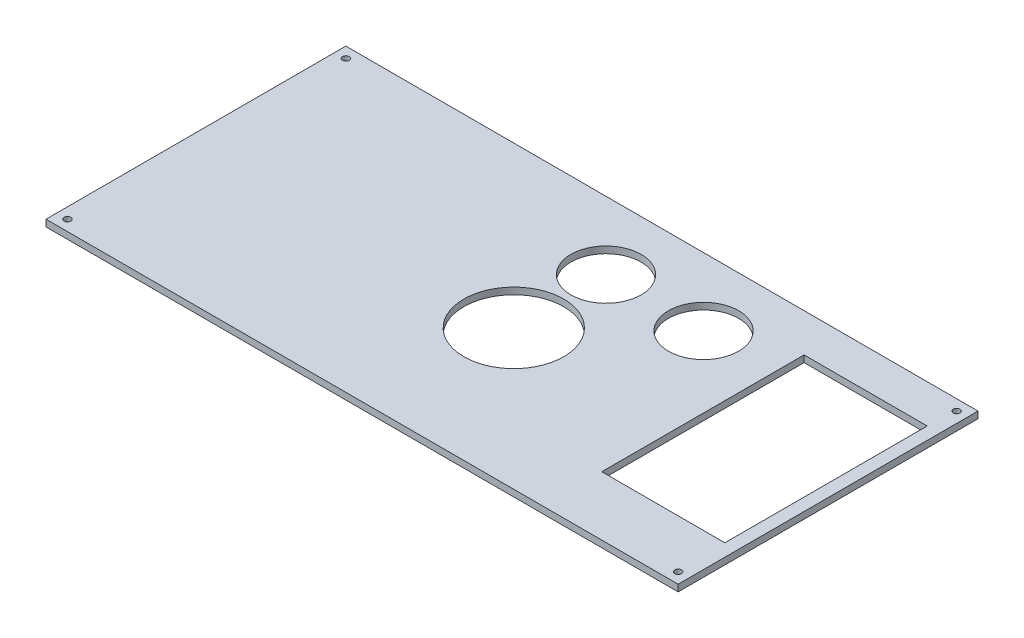
ISO-10303-21;
HEADER;
FILE_DESCRIPTION(('STEP AP214'),'2;1');
FILE_NAME('part.step','',(''),(''),'','','');
FILE_SCHEMA(('AUTOMOTIVE_DESIGN { 1 0 10303 214 1 1 1 1 }'));
ENDSEC;
DATA;
#1=APPLICATION_CONTEXT('core data for automotive mechanical design processes');
#2=APPLICATION_PROTOCOL_DEFINITION('international standard','automotive_design',2000,#1);
#3=PRODUCT_CONTEXT('',#1,'mechanical');
#4=PRODUCT('Part','Part','',(#3));
#5=PRODUCT_RELATED_PRODUCT_CATEGORY('part','',(#4));
#6=PRODUCT_DEFINITION_FORMATION('','',#4);
#7=PRODUCT_DEFINITION_CONTEXT('part definition',#1,'design');
#8=PRODUCT_DEFINITION('design','',#6,#7);
#9=PRODUCT_DEFINITION_SHAPE('','',#8);
#10=(LENGTH_UNIT() NAMED_UNIT(*) SI_UNIT(.MILLI.,.METRE.));
#11=(NAMED_UNIT(*) PLANE_ANGLE_UNIT() SI_UNIT($,.RADIAN.));
#12=(NAMED_UNIT(*) SI_UNIT($,.STERADIAN.) SOLID_ANGLE_UNIT());
#13=UNCERTAINTY_MEASURE_WITH_UNIT(LENGTH_MEASURE(1.E-05),#10,'distance_accuracy_value','');
#14=(GEOMETRIC_REPRESENTATION_CONTEXT(3) GLOBAL_UNCERTAINTY_ASSIGNED_CONTEXT((#13)) GLOBAL_UNIT_ASSIGNED_CONTEXT((#10,
#11,#12)) REPRESENTATION_CONTEXT('',''));
#15=CARTESIAN_POINT('',(0.,0.,0.));
#16=DIRECTION('',(0.,0.,1.));
#17=DIRECTION('',(1.,0.,0.));
#18=AXIS2_PLACEMENT_3D('',#15,#16,#17);
#19=CARTESIAN_POINT('',(-117.945,2.5,55.945));
#20=DIRECTION('',(1.,0.,0.));
#21=DIRECTION('',(0.,0.,-1.));
#22=AXIS2_PLACEMENT_3D('',#19,#20,#21);
#23=PLANE('',#22);
#24=DIRECTION('',(0.,0.,1.));
#25=VECTOR('',#24,1.);
#26=CARTESIAN_POINT('',(-117.945,0.,55.945));
#27=LINE('',#26,#25);
#28=CARTESIAN_POINT('',(-117.945,0.,-55.945));
#29=VERTEX_POINT('',#28);
#30=CARTESIAN_POINT('',(-117.945,0.,55.945));
#31=VERTEX_POINT('',#30);
#32=EDGE_CURVE('E210',#29,#31,#27,.T.);
#33=ORIENTED_EDGE('',*,*,#32,.T.);
#34=DIRECTION('',(0.,-1.,0.));
#35=VECTOR('',#34,1.);
#36=CARTESIAN_POINT('',(-117.945,2.5,55.945));
#37=LINE('',#36,#35);
#38=CARTESIAN_POINT('',(-117.945,2.5,55.945));
#39=VERTEX_POINT('',#38);
#40=EDGE_CURVE('E11',#39,#31,#37,.T.);
#41=ORIENTED_EDGE('',*,*,#40,.F.);
#42=DIRECTION('',(0.,0.,1.));
#43=VECTOR('',#42,1.);
#44=CARTESIAN_POINT('',(-117.945,2.5,55.945));
#45=LINE('',#44,#43);
#46=CARTESIAN_POINT('',(-117.945,2.5,-55.945));
#47=VERTEX_POINT('',#46);
#48=EDGE_CURVE('E214',#47,#39,#45,.T.);
#49=ORIENTED_EDGE('',*,*,#48,.F.);
#50=DIRECTION('',(0.,-1.,0.));
#51=VECTOR('',#50,1.);
#52=CARTESIAN_POINT('',(-117.945,2.5,-55.945));
#53=LINE('',#52,#51);
#54=EDGE_CURVE('E228',#47,#29,#53,.T.);
#55=ORIENTED_EDGE('',*,*,#54,.T.);
#56=EDGE_LOOP('',(#33,#41,#49,#55));
#57=FACE_BOUND('',#56,.T.);
#58=ADVANCED_FACE('F44',(#57),#23,.F.);
#59=CARTESIAN_POINT('',(117.945,2.5,55.945));
#60=DIRECTION('',(0.,0.,-1.));
#61=DIRECTION('',(-1.,0.,0.));
#62=AXIS2_PLACEMENT_3D('',#59,#60,#61);
#63=PLANE('',#62);
#64=DIRECTION('',(1.,0.,0.));
#65=VECTOR('',#64,1.);
#66=CARTESIAN_POINT('',(117.945,0.,55.945));
#67=LINE('',#66,#65);
#68=CARTESIAN_POINT('',(117.945,0.,55.945));
#69=VERTEX_POINT('',#68);
#70=EDGE_CURVE('E232',#31,#69,#67,.T.);
#71=ORIENTED_EDGE('',*,*,#70,.T.);
#72=DIRECTION('',(0.,-1.,0.));
#73=VECTOR('',#72,1.);
#74=CARTESIAN_POINT('',(117.945,2.5,55.945));
#75=LINE('',#74,#73);
#76=CARTESIAN_POINT('',(117.945,2.5,55.945));
#77=VERTEX_POINT('',#76);
#78=EDGE_CURVE('E52',#77,#69,#75,.T.);
#79=ORIENTED_EDGE('',*,*,#78,.F.);
#80=DIRECTION('',(1.,0.,0.));
#81=VECTOR('',#80,1.);
#82=CARTESIAN_POINT('',(117.945,2.5,55.945));
#83=LINE('',#82,#81);
#84=EDGE_CURVE('E218',#39,#77,#83,.T.);
#85=ORIENTED_EDGE('',*,*,#84,.F.);
#86=ORIENTED_EDGE('',*,*,#40,.T.);
#87=EDGE_LOOP('',(#71,#79,#85,#86));
#88=FACE_BOUND('',#87,.T.);
#89=ADVANCED_FACE('F267',(#88),#63,.F.);
#90=CARTESIAN_POINT('',(117.945,2.5,55.945));
#91=DIRECTION('',(-1.,0.,0.));
#92=DIRECTION('',(0.,0.,1.));
#93=AXIS2_PLACEMENT_3D('',#90,#91,#92);
#94=PLANE('',#93);
#95=DIRECTION('',(0.,0.,-1.));
#96=VECTOR('',#95,1.);
#97=CARTESIAN_POINT('',(117.945,0.,55.945));
#98=LINE('',#97,#96);
#99=CARTESIAN_POINT('',(117.945,0.,-55.945));
#100=VERTEX_POINT('',#99);
#101=EDGE_CURVE('E235',#69,#100,#98,.T.);
#102=ORIENTED_EDGE('',*,*,#101,.T.);
#103=DIRECTION('',(0.,-1.,0.));
#104=VECTOR('',#103,1.);
#105=CARTESIAN_POINT('',(117.945,2.5,-55.945));
#106=LINE('',#105,#104);
#107=CARTESIAN_POINT('',(117.945,2.5,-55.945));
#108=VERTEX_POINT('',#107);
#109=EDGE_CURVE('E243',#108,#100,#106,.T.);
#110=ORIENTED_EDGE('',*,*,#109,.F.);
#111=DIRECTION('',(0.,0.,-1.));
#112=VECTOR('',#111,1.);
#113=CARTESIAN_POINT('',(117.945,2.5,55.945));
#114=LINE('',#113,#112);
#115=EDGE_CURVE('E222',#77,#108,#114,.T.);
#116=ORIENTED_EDGE('',*,*,#115,.F.);
#117=ORIENTED_EDGE('',*,*,#78,.T.);
#118=EDGE_LOOP('',(#102,#110,#116,#117));
#119=FACE_BOUND('',#118,.T.);
#120=ADVANCED_FACE('F252',(#119),#94,.F.);
#121=CARTESIAN_POINT('',(117.945,2.5,-55.945));
#122=DIRECTION('',(0.,0.,1.));
#123=DIRECTION('',(1.,0.,0.));
#124=AXIS2_PLACEMENT_3D('',#121,#122,#123);
#125=PLANE('',#124);
#126=DIRECTION('',(-1.,0.,0.));
#127=VECTOR('',#126,1.);
#128=CARTESIAN_POINT('',(117.945,0.,-55.945));
#129=LINE('',#128,#127);
#130=EDGE_CURVE('E219',#100,#29,#129,.T.);
#131=ORIENTED_EDGE('',*,*,#130,.T.);
#132=ORIENTED_EDGE('',*,*,#54,.F.);
#133=DIRECTION('',(-1.,0.,0.));
#134=VECTOR('',#133,1.);
#135=CARTESIAN_POINT('',(117.945,2.5,-55.945));
#136=LINE('',#135,#134);
#137=EDGE_CURVE('E225',#108,#47,#136,.T.);
#138=ORIENTED_EDGE('',*,*,#137,.F.);
#139=ORIENTED_EDGE('',*,*,#109,.T.);
#140=EDGE_LOOP('',(#131,#132,#138,#139));
#141=FACE_BOUND('',#140,.T.);
#142=ADVANCED_FACE('F260',(#141),#125,.F.);
#143=CARTESIAN_POINT('',(0.,2.5,0.));
#144=DIRECTION('',(0.,1.,0.));
#145=DIRECTION('',(0.,0.,1.));
#146=AXIS2_PLACEMENT_3D('',#143,#144,#145);
#147=PLANE('',#146);
#148=DIRECTION('',(0.,0.,-1.));
#149=VECTOR('',#148,1.);
#150=CARTESIAN_POINT('',(113.2871,2.5,0.));
#151=LINE('',#150,#149);
#152=CARTESIAN_POINT('',(113.2871,2.5,33.8537));
#153=VERTEX_POINT('',#152);
#154=CARTESIAN_POINT('',(113.2871,2.5,-41.645));
#155=VERTEX_POINT('',#154);
#156=EDGE_CURVE('E115',#153,#155,#151,.T.);
#157=ORIENTED_EDGE('',*,*,#156,.F.);
#158=DIRECTION('',(1.,0.,0.));
#159=VECTOR('',#158,1.);
#160=CARTESIAN_POINT('',(0.,2.5,33.8537));
#161=LINE('',#160,#159);
#162=CARTESIAN_POINT('',(67.3583,2.5,33.8537));
#163=VERTEX_POINT('',#162);
#164=EDGE_CURVE('E176',#163,#153,#161,.T.);
#165=ORIENTED_EDGE('',*,*,#164,.F.);
#166=DIRECTION('',(0.,0.,1.));
#167=VECTOR('',#166,1.);
#168=CARTESIAN_POINT('',(67.3583,2.5,0.));
#169=LINE('',#168,#167);
#170=CARTESIAN_POINT('',(67.3583,2.5,-41.645));
#171=VERTEX_POINT('',#170);
#172=EDGE_CURVE('E173',#171,#163,#169,.T.);
#173=ORIENTED_EDGE('',*,*,#172,.F.);
#174=DIRECTION('',(-1.,0.,0.));
#175=VECTOR('',#174,1.);
#176=CARTESIAN_POINT('',(0.,2.5,-41.645));
#177=LINE('',#176,#175);
#178=EDGE_CURVE('E170',#155,#171,#177,.T.);
#179=ORIENTED_EDGE('',*,*,#178,.F.);
#180=EDGE_LOOP('',(#157,#165,#173,#179));
#181=FACE_BOUND('',#180,.T.);
#182=CARTESIAN_POINT('',(40.845,2.5,-30.6237));
#183=DIRECTION('',(0.,1.,0.));
#184=DIRECTION('',(0.,0.,1.));
#185=AXIS2_PLACEMENT_3D('',#182,#183,#184);
#186=CIRCLE('',#185,13.1);
#187=CARTESIAN_POINT('',(40.845,2.5,-17.5237));
#188=VERTEX_POINT('',#187);
#189=EDGE_CURVE('E166',#188,#188,#186,.T.);
#190=ORIENTED_EDGE('',*,*,#189,.F.);
#191=EDGE_LOOP('',(#190));
#192=FACE_BOUND('',#191,.T.);
#193=CARTESIAN_POINT('',(4.44500000000002,2.5,-30.6237));
#194=DIRECTION('',(0.,1.,0.));
#195=DIRECTION('',(0.,0.,1.));
#196=AXIS2_PLACEMENT_3D('',#193,#194,#195);
#197=CIRCLE('',#196,13.1);
#198=CARTESIAN_POINT('',(4.44500000000002,2.5,-17.5237));
#199=VERTEX_POINT('',#198);
#200=EDGE_CURVE('E162',#199,#199,#197,.T.);
#201=ORIENTED_EDGE('',*,*,#200,.F.);
#202=EDGE_LOOP('',(#201));
#203=FACE_BOUND('',#202,.T.);
#204=CARTESIAN_POINT('',(4.445,2.5,3.77629999999999));
#205=DIRECTION('',(0.,1.,0.));
#206=DIRECTION('',(0.,0.,1.));
#207=AXIS2_PLACEMENT_3D('',#204,#205,#206);
#208=CIRCLE('',#207,18.65);
#209=CARTESIAN_POINT('',(4.445,2.5,22.4263));
#210=VERTEX_POINT('',#209);
#211=EDGE_CURVE('E145',#210,#210,#208,.T.);
#212=ORIENTED_EDGE('',*,*,#211,.F.);
#213=EDGE_LOOP('',(#212));
#214=FACE_BOUND('',#213,.T.);
#215=CARTESIAN_POINT('',(113.945,2.5,-51.945));
#216=DIRECTION('',(0.,1.,0.));
#217=DIRECTION('',(0.,0.,1.));
#218=AXIS2_PLACEMENT_3D('',#215,#216,#217);
#219=CIRCLE('',#218,1.25);
#220=CARTESIAN_POINT('',(113.945,2.5,-50.695));
#221=VERTEX_POINT('',#220);
#222=EDGE_CURVE('E199',#221,#221,#219,.T.);
#223=ORIENTED_EDGE('',*,*,#222,.F.);
#224=EDGE_LOOP('',(#223));
#225=FACE_BOUND('',#224,.T.);
#226=CARTESIAN_POINT('',(113.945,2.5,51.945));
#227=DIRECTION('',(0.,1.,0.));
#228=DIRECTION('',(0.,0.,1.));
#229=AXIS2_PLACEMENT_3D('',#226,#227,#228);
#230=CIRCLE('',#229,1.25);
#231=CARTESIAN_POINT('',(113.945,2.5,53.195));
#232=VERTEX_POINT('',#231);
#233=EDGE_CURVE('E191',#232,#232,#230,.T.);
#234=ORIENTED_EDGE('',*,*,#233,.F.);
#235=EDGE_LOOP('',(#234));
#236=FACE_BOUND('',#235,.T.);
#237=CARTESIAN_POINT('',(-113.945,2.5,51.945));
#238=DIRECTION('',(0.,1.,0.));
#239=DIRECTION('',(0.,0.,1.));
#240=AXIS2_PLACEMENT_3D('',#237,#238,#239);
#241=CIRCLE('',#240,1.25);
#242=CARTESIAN_POINT('',(-113.945,2.5,53.195));
#243=VERTEX_POINT('',#242);
#244=EDGE_CURVE('E182',#243,#243,#241,.T.);
#245=ORIENTED_EDGE('',*,*,#244,.F.);
#246=EDGE_LOOP('',(#245));
#247=FACE_BOUND('',#246,.T.);
#248=CARTESIAN_POINT('',(-113.945,2.5,-51.945));
#249=DIRECTION('',(0.,1.,0.));
#250=DIRECTION('',(0.,0.,1.));
#251=AXIS2_PLACEMENT_3D('',#248,#249,#250);
#252=CIRCLE('',#251,1.25);
#253=CARTESIAN_POINT('',(-113.945,2.5,-50.695));
#254=VERTEX_POINT('',#253);
#255=EDGE_CURVE('E186',#254,#254,#252,.T.);
#256=ORIENTED_EDGE('',*,*,#255,.F.);
#257=EDGE_LOOP('',(#256));
#258=FACE_BOUND('',#257,.T.);
#259=ORIENTED_EDGE('',*,*,#48,.T.);
#260=ORIENTED_EDGE('',*,*,#84,.T.);
#261=ORIENTED_EDGE('',*,*,#115,.T.);
#262=ORIENTED_EDGE('',*,*,#137,.T.);
#263=EDGE_LOOP('',(#259,#260,#261,#262));
#264=FACE_BOUND('',#263,.T.);
#265=ADVANCED_FACE('F266',(#181,#192,#203,#214,#225,#236,#247,#258,#264),#147,.T.);
#266=CARTESIAN_POINT('',(0.,0.,0.));
#267=DIRECTION('',(0.,1.,0.));
#268=DIRECTION('',(0.,0.,1.));
#269=AXIS2_PLACEMENT_3D('',#266,#267,#268);
#270=PLANE('',#269);
#271=DIRECTION('',(1.,0.,0.));
#272=VECTOR('',#271,1.);
#273=CARTESIAN_POINT('',(113.2871,0.,33.8537));
#274=LINE('',#273,#272);
#275=CARTESIAN_POINT('',(67.3583,0.,33.8537));
#276=VERTEX_POINT('',#275);
#277=CARTESIAN_POINT('',(113.2871,0.,33.8537));
#278=VERTEX_POINT('',#277);
#279=EDGE_CURVE('E119',#276,#278,#274,.T.);
#280=ORIENTED_EDGE('',*,*,#279,.T.);
#281=DIRECTION('',(0.,0.,-1.));
#282=VECTOR('',#281,1.);
#283=CARTESIAN_POINT('',(113.2871,0.,-41.645));
#284=LINE('',#283,#282);
#285=CARTESIAN_POINT('',(113.2871,0.,-41.645));
#286=VERTEX_POINT('',#285);
#287=EDGE_CURVE('E112',#278,#286,#284,.T.);
#288=ORIENTED_EDGE('',*,*,#287,.T.);
#289=DIRECTION('',(-1.,0.,0.));
#290=VECTOR('',#289,1.);
#291=CARTESIAN_POINT('',(113.2871,0.,-41.645));
#292=LINE('',#291,#290);
#293=CARTESIAN_POINT('',(67.3583,0.,-41.645));
#294=VERTEX_POINT('',#293);
#295=EDGE_CURVE('E122',#286,#294,#292,.T.);
#296=ORIENTED_EDGE('',*,*,#295,.T.);
#297=DIRECTION('',(0.,0.,1.));
#298=VECTOR('',#297,1.);
#299=CARTESIAN_POINT('',(67.3583,0.,-41.645));
#300=LINE('',#299,#298);
#301=EDGE_CURVE('E67',#294,#276,#300,.T.);
#302=ORIENTED_EDGE('',*,*,#301,.T.);
#303=EDGE_LOOP('',(#280,#288,#296,#302));
#304=FACE_BOUND('',#303,.T.);
#305=CARTESIAN_POINT('',(40.845,0.,-30.6237));
#306=DIRECTION('',(0.,1.,0.));
#307=DIRECTION('',(0.,0.,1.));
#308=AXIS2_PLACEMENT_3D('',#305,#306,#307);
#309=CIRCLE('',#308,13.1);
#310=CARTESIAN_POINT('',(40.845,0.,-17.5237));
#311=VERTEX_POINT('',#310);
#312=EDGE_CURVE('E131',#311,#311,#309,.T.);
#313=ORIENTED_EDGE('',*,*,#312,.T.);
#314=EDGE_LOOP('',(#313));
#315=FACE_BOUND('',#314,.T.);
#316=CARTESIAN_POINT('',(4.44500000000002,0.,-30.6237));
#317=DIRECTION('',(0.,1.,0.));
#318=DIRECTION('',(0.,0.,1.));
#319=AXIS2_PLACEMENT_3D('',#316,#317,#318);
#320=CIRCLE('',#319,13.1);
#321=CARTESIAN_POINT('',(4.44500000000002,0.,-17.5237));
#322=VERTEX_POINT('',#321);
#323=EDGE_CURVE('E135',#322,#322,#320,.T.);
#324=ORIENTED_EDGE('',*,*,#323,.T.);
#325=EDGE_LOOP('',(#324));
#326=FACE_BOUND('',#325,.T.);
#327=CARTESIAN_POINT('',(4.445,0.,3.77629999999999));
#328=DIRECTION('',(0.,1.,0.));
#329=DIRECTION('',(0.,0.,1.));
#330=AXIS2_PLACEMENT_3D('',#327,#328,#329);
#331=CIRCLE('',#330,18.65);
#332=CARTESIAN_POINT('',(4.445,0.,22.4263));
#333=VERTEX_POINT('',#332);
#334=EDGE_CURVE('E155',#333,#333,#331,.T.);
#335=ORIENTED_EDGE('',*,*,#334,.T.);
#336=EDGE_LOOP('',(#335));
#337=FACE_BOUND('',#336,.T.);
#338=CARTESIAN_POINT('',(113.945,0.,-51.945));
#339=DIRECTION('',(0.,1.,0.));
#340=DIRECTION('',(0.,0.,1.));
#341=AXIS2_PLACEMENT_3D('',#338,#339,#340);
#342=CIRCLE('',#341,1.25);
#343=CARTESIAN_POINT('',(113.945,0.,-50.695));
#344=VERTEX_POINT('',#343);
#345=EDGE_CURVE('E181',#344,#344,#342,.T.);
#346=ORIENTED_EDGE('',*,*,#345,.T.);
#347=EDGE_LOOP('',(#346));
#348=FACE_BOUND('',#347,.T.);
#349=CARTESIAN_POINT('',(113.945,0.,51.945));
#350=DIRECTION('',(0.,1.,0.));
#351=DIRECTION('',(0.,0.,1.));
#352=AXIS2_PLACEMENT_3D('',#349,#350,#351);
#353=CIRCLE('',#352,1.25);
#354=CARTESIAN_POINT('',(113.945,0.,53.195));
#355=VERTEX_POINT('',#354);
#356=EDGE_CURVE('E195',#355,#355,#353,.T.);
#357=ORIENTED_EDGE('',*,*,#356,.T.);
#358=EDGE_LOOP('',(#357));
#359=FACE_BOUND('',#358,.T.);
#360=CARTESIAN_POINT('',(-113.945,0.,51.945));
#361=DIRECTION('',(0.,1.,0.));
#362=DIRECTION('',(0.,0.,1.));
#363=AXIS2_PLACEMENT_3D('',#360,#361,#362);
#364=CIRCLE('',#363,1.25);
#365=CARTESIAN_POINT('',(-113.945,0.,53.195));
#366=VERTEX_POINT('',#365);
#367=EDGE_CURVE('E187',#366,#366,#364,.T.);
#368=ORIENTED_EDGE('',*,*,#367,.T.);
#369=EDGE_LOOP('',(#368));
#370=FACE_BOUND('',#369,.T.);
#371=CARTESIAN_POINT('',(-113.945,0.,-51.945));
#372=DIRECTION('',(0.,1.,0.));
#373=DIRECTION('',(0.,0.,1.));
#374=AXIS2_PLACEMENT_3D('',#371,#372,#373);
#375=CIRCLE('',#374,1.25);
#376=CARTESIAN_POINT('',(-113.945,0.,-50.695));
#377=VERTEX_POINT('',#376);
#378=EDGE_CURVE('E206',#377,#377,#375,.T.);
#379=ORIENTED_EDGE('',*,*,#378,.T.);
#380=EDGE_LOOP('',(#379));
#381=FACE_BOUND('',#380,.T.);
#382=ORIENTED_EDGE('',*,*,#32,.F.);
#383=ORIENTED_EDGE('',*,*,#130,.F.);
#384=ORIENTED_EDGE('',*,*,#101,.F.);
#385=ORIENTED_EDGE('',*,*,#70,.F.);
#386=EDGE_LOOP('',(#382,#383,#384,#385));
#387=FACE_BOUND('',#386,.T.);
#388=ADVANCED_FACE('F127',(#304,#315,#326,#337,#348,#359,#370,#381,#387),#270,.F.);
#389=CARTESIAN_POINT('',(-113.945,0.,-51.945));
#390=DIRECTION('',(0.,1.,0.));
#391=DIRECTION('',(0.,0.,1.));
#392=AXIS2_PLACEMENT_3D('',#389,#390,#391);
#393=CYLINDRICAL_SURFACE('',#392,1.25);
#394=ORIENTED_EDGE('',*,*,#378,.F.);
#395=EDGE_LOOP('',(#394));
#396=FACE_BOUND('',#395,.T.);
#397=ORIENTED_EDGE('',*,*,#255,.T.);
#398=EDGE_LOOP('',(#397));
#399=FACE_BOUND('',#398,.T.);
#400=ADVANCED_FACE('F279',(#396,#399),#393,.F.);
#401=CARTESIAN_POINT('',(-113.945,0.,51.945));
#402=DIRECTION('',(0.,1.,0.));
#403=DIRECTION('',(0.,0.,1.));
#404=AXIS2_PLACEMENT_3D('',#401,#402,#403);
#405=CYLINDRICAL_SURFACE('',#404,1.25);
#406=ORIENTED_EDGE('',*,*,#367,.F.);
#407=EDGE_LOOP('',(#406));
#408=FACE_BOUND('',#407,.T.);
#409=ORIENTED_EDGE('',*,*,#244,.T.);
#410=EDGE_LOOP('',(#409));
#411=FACE_BOUND('',#410,.T.);
#412=ADVANCED_FACE('F285',(#408,#411),#405,.F.);
#413=CARTESIAN_POINT('',(113.945,0.,51.945));
#414=DIRECTION('',(0.,1.,0.));
#415=DIRECTION('',(0.,0.,1.));
#416=AXIS2_PLACEMENT_3D('',#413,#414,#415);
#417=CYLINDRICAL_SURFACE('',#416,1.25);
#418=ORIENTED_EDGE('',*,*,#356,.F.);
#419=EDGE_LOOP('',(#418));
#420=FACE_BOUND('',#419,.T.);
#421=ORIENTED_EDGE('',*,*,#233,.T.);
#422=EDGE_LOOP('',(#421));
#423=FACE_BOUND('',#422,.T.);
#424=ADVANCED_FACE('F291',(#420,#423),#417,.F.);
#425=CARTESIAN_POINT('',(113.945,0.,-51.945));
#426=DIRECTION('',(0.,1.,0.));
#427=DIRECTION('',(0.,0.,1.));
#428=AXIS2_PLACEMENT_3D('',#425,#426,#427);
#429=CYLINDRICAL_SURFACE('',#428,1.25);
#430=ORIENTED_EDGE('',*,*,#345,.F.);
#431=EDGE_LOOP('',(#430));
#432=FACE_BOUND('',#431,.T.);
#433=ORIENTED_EDGE('',*,*,#222,.T.);
#434=EDGE_LOOP('',(#433));
#435=FACE_BOUND('',#434,.T.);
#436=ADVANCED_FACE('F287',(#432,#435),#429,.F.);
#437=CARTESIAN_POINT('',(4.445,0.,3.77629999999999));
#438=DIRECTION('',(0.,1.,0.));
#439=DIRECTION('',(0.,0.,1.));
#440=AXIS2_PLACEMENT_3D('',#437,#438,#439);
#441=CYLINDRICAL_SURFACE('',#440,18.65);
#442=ORIENTED_EDGE('',*,*,#211,.T.);
#443=EDGE_LOOP('',(#442));
#444=FACE_BOUND('',#443,.T.);
#445=ORIENTED_EDGE('',*,*,#334,.F.);
#446=EDGE_LOOP('',(#445));
#447=FACE_BOUND('',#446,.T.);
#448=ADVANCED_FACE('F290',(#444,#447),#441,.F.);
#449=CARTESIAN_POINT('',(4.44500000000002,0.,-30.6237));
#450=DIRECTION('',(0.,1.,0.));
#451=DIRECTION('',(0.,0.,1.));
#452=AXIS2_PLACEMENT_3D('',#449,#450,#451);
#453=CYLINDRICAL_SURFACE('',#452,13.1);
#454=ORIENTED_EDGE('',*,*,#200,.T.);
#455=EDGE_LOOP('',(#454));
#456=FACE_BOUND('',#455,.T.);
#457=ORIENTED_EDGE('',*,*,#323,.F.);
#458=EDGE_LOOP('',(#457));
#459=FACE_BOUND('',#458,.T.);
#460=ADVANCED_FACE('F301',(#456,#459),#453,.F.);
#461=CARTESIAN_POINT('',(40.845,0.,-30.6237));
#462=DIRECTION('',(0.,1.,0.));
#463=DIRECTION('',(0.,0.,1.));
#464=AXIS2_PLACEMENT_3D('',#461,#462,#463);
#465=CYLINDRICAL_SURFACE('',#464,13.1);
#466=ORIENTED_EDGE('',*,*,#189,.T.);
#467=EDGE_LOOP('',(#466));
#468=FACE_BOUND('',#467,.T.);
#469=ORIENTED_EDGE('',*,*,#312,.F.);
#470=EDGE_LOOP('',(#469));
#471=FACE_BOUND('',#470,.T.);
#472=ADVANCED_FACE('F305',(#468,#471),#465,.F.);
#473=CARTESIAN_POINT('',(113.2871,0.,-41.645));
#474=DIRECTION('',(1.,0.,0.));
#475=DIRECTION('',(0.,0.,-1.));
#476=AXIS2_PLACEMENT_3D('',#473,#474,#475);
#477=PLANE('',#476);
#478=ORIENTED_EDGE('',*,*,#156,.T.);
#479=DIRECTION('',(0.,1.,0.));
#480=VECTOR('',#479,1.);
#481=CARTESIAN_POINT('',(113.2871,0.,-41.645));
#482=LINE('',#481,#480);
#483=EDGE_CURVE('E59',#286,#155,#482,.T.);
#484=ORIENTED_EDGE('',*,*,#483,.F.);
#485=ORIENTED_EDGE('',*,*,#287,.F.);
#486=DIRECTION('',(0.,1.,0.));
#487=VECTOR('',#486,1.);
#488=CARTESIAN_POINT('',(113.2871,0.,33.8537));
#489=LINE('',#488,#487);
#490=EDGE_CURVE('E142',#278,#153,#489,.T.);
#491=ORIENTED_EDGE('',*,*,#490,.T.);
#492=EDGE_LOOP('',(#478,#484,#485,#491));
#493=FACE_BOUND('',#492,.T.);
#494=ADVANCED_FACE('F109',(#493),#477,.F.);
#495=CARTESIAN_POINT('',(113.2871,0.,33.8537));
#496=DIRECTION('',(0.,0.,1.));
#497=DIRECTION('',(1.,0.,0.));
#498=AXIS2_PLACEMENT_3D('',#495,#496,#497);
#499=PLANE('',#498);
#500=ORIENTED_EDGE('',*,*,#164,.T.);
#501=ORIENTED_EDGE('',*,*,#490,.F.);
#502=ORIENTED_EDGE('',*,*,#279,.F.);
#503=DIRECTION('',(0.,1.,0.));
#504=VECTOR('',#503,1.);
#505=CARTESIAN_POINT('',(67.3583,0.,33.8537));
#506=LINE('',#505,#504);
#507=EDGE_CURVE('E146',#276,#163,#506,.T.);
#508=ORIENTED_EDGE('',*,*,#507,.T.);
#509=EDGE_LOOP('',(#500,#501,#502,#508));
#510=FACE_BOUND('',#509,.T.);
#511=ADVANCED_FACE('F312',(#510),#499,.F.);
#512=CARTESIAN_POINT('',(67.3583,0.,-41.645));
#513=DIRECTION('',(-1.,0.,0.));
#514=DIRECTION('',(0.,0.,1.));
#515=AXIS2_PLACEMENT_3D('',#512,#513,#514);
#516=PLANE('',#515);
#517=ORIENTED_EDGE('',*,*,#172,.T.);
#518=ORIENTED_EDGE('',*,*,#507,.F.);
#519=ORIENTED_EDGE('',*,*,#301,.F.);
#520=DIRECTION('',(0.,1.,0.));
#521=VECTOR('',#520,1.);
#522=CARTESIAN_POINT('',(67.3583,0.,-41.645));
#523=LINE('',#522,#521);
#524=EDGE_CURVE('E118',#294,#171,#523,.T.);
#525=ORIENTED_EDGE('',*,*,#524,.T.);
#526=EDGE_LOOP('',(#517,#518,#519,#525));
#527=FACE_BOUND('',#526,.T.);
#528=ADVANCED_FACE('F315',(#527),#516,.F.);
#529=CARTESIAN_POINT('',(113.2871,0.,-41.645));
#530=DIRECTION('',(0.,0.,-1.));
#531=DIRECTION('',(-1.,0.,0.));
#532=AXIS2_PLACEMENT_3D('',#529,#530,#531);
#533=PLANE('',#532);
#534=ORIENTED_EDGE('',*,*,#178,.T.);
#535=ORIENTED_EDGE('',*,*,#524,.F.);
#536=ORIENTED_EDGE('',*,*,#295,.F.);
#537=ORIENTED_EDGE('',*,*,#483,.T.);
#538=EDGE_LOOP('',(#534,#535,#536,#537));
#539=FACE_BOUND('',#538,.T.);
#540=ADVANCED_FACE('F123',(#539),#533,.F.);
#541=CLOSED_SHELL('',(#58,#89,#120,#142,#265,#388,#400,#412,#424,#436,#448,#460,#472,#494,#511,
#528,#540));
#542=MANIFOLD_SOLID_BREP('B2',#541);
#543=ADVANCED_BREP_SHAPE_REPRESENTATION('',(#18,#542),#14);
#544=SHAPE_DEFINITION_REPRESENTATION(#9,#543);
ENDSEC;
END-ISO-10303-21;
